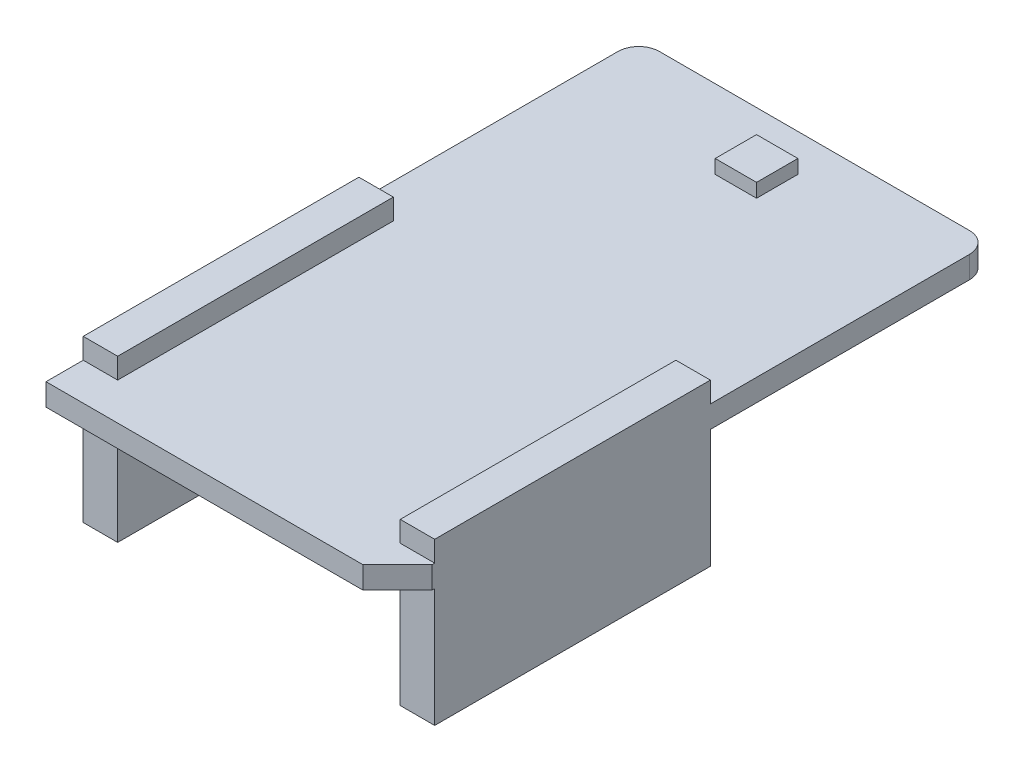
ISO-10303-21;
HEADER;
FILE_DESCRIPTION(('STEP AP214'),'2;1');
FILE_NAME('part.step','',(''),(''),'','','');
FILE_SCHEMA(('AUTOMOTIVE_DESIGN { 1 0 10303 214 1 1 1 1 }'));
ENDSEC;
DATA;
#1=APPLICATION_CONTEXT('core data for automotive mechanical design processes');
#2=APPLICATION_PROTOCOL_DEFINITION('international standard','automotive_design',2000,#1);
#3=PRODUCT_CONTEXT('',#1,'mechanical');
#4=PRODUCT('Part','Part','',(#3));
#5=PRODUCT_RELATED_PRODUCT_CATEGORY('part','',(#4));
#6=PRODUCT_DEFINITION_FORMATION('','',#4);
#7=PRODUCT_DEFINITION_CONTEXT('part definition',#1,'design');
#8=PRODUCT_DEFINITION('design','',#6,#7);
#9=PRODUCT_DEFINITION_SHAPE('','',#8);
#10=(LENGTH_UNIT() NAMED_UNIT(*) SI_UNIT(.MILLI.,.METRE.));
#11=(NAMED_UNIT(*) PLANE_ANGLE_UNIT() SI_UNIT($,.RADIAN.));
#12=(NAMED_UNIT(*) SI_UNIT($,.STERADIAN.) SOLID_ANGLE_UNIT());
#13=UNCERTAINTY_MEASURE_WITH_UNIT(LENGTH_MEASURE(1.E-05),#10,'distance_accuracy_value','');
#14=(GEOMETRIC_REPRESENTATION_CONTEXT(3) GLOBAL_UNCERTAINTY_ASSIGNED_CONTEXT((#13)) GLOBAL_UNIT_ASSIGNED_CONTEXT((#10,
#11,#12)) REPRESENTATION_CONTEXT('',''));
#15=CARTESIAN_POINT('',(0.,0.,0.));
#16=DIRECTION('',(0.,0.,1.));
#17=DIRECTION('',(1.,0.,0.));
#18=AXIS2_PLACEMENT_3D('',#15,#16,#17);
#19=CARTESIAN_POINT('',(0.,1.6,0.));
#20=DIRECTION('',(0.,-1.,0.));
#21=DIRECTION('',(0.,0.,-1.));
#22=AXIS2_PLACEMENT_3D('',#19,#20,#21);
#23=PLANE('',#22);
#24=DIRECTION('',(1.,0.,0.));
#25=VECTOR('',#24,1.);
#26=CARTESIAN_POINT('',(0.,1.6,0.));
#27=LINE('',#26,#25);
#28=CARTESIAN_POINT('',(0.,1.6,0.));
#29=VERTEX_POINT('',#28);
#30=CARTESIAN_POINT('',(23.,1.6,0.));
#31=VERTEX_POINT('',#30);
#32=EDGE_CURVE('E432',#29,#31,#27,.T.);
#33=ORIENTED_EDGE('',*,*,#32,.T.);
#34=DIRECTION('',(-0.70710678118655,0.,0.707106781186546));
#35=VECTOR('',#34,1.);
#36=CARTESIAN_POINT('',(25.5,1.6,-2.5));
#37=LINE('',#36,#35);
#38=CARTESIAN_POINT('',(25.5,1.6,-2.5));
#39=VERTEX_POINT('',#38);
#40=EDGE_CURVE('E12',#31,#39,#37,.F.);
#41=ORIENTED_EDGE('',*,*,#40,.T.);
#42=DIRECTION('',(0.,0.,-1.));
#43=VECTOR('',#42,1.);
#44=CARTESIAN_POINT('',(25.5,1.6,0.));
#45=LINE('',#44,#43);
#46=CARTESIAN_POINT('',(25.5,1.6,-2.7));
#47=VERTEX_POINT('',#46);
#48=EDGE_CURVE('E437',#39,#47,#45,.T.);
#49=ORIENTED_EDGE('',*,*,#48,.T.);
#50=DIRECTION('',(-1.,0.,0.));
#51=VECTOR('',#50,1.);
#52=CARTESIAN_POINT('',(0.,1.6,-2.7));
#53=LINE('',#52,#51);
#54=CARTESIAN_POINT('',(23.,1.6,-2.7));
#55=VERTEX_POINT('',#54);
#56=EDGE_CURVE('E359',#47,#55,#53,.T.);
#57=ORIENTED_EDGE('',*,*,#56,.T.);
#58=DIRECTION('',(0.,0.,-1.));
#59=VECTOR('',#58,1.);
#60=CARTESIAN_POINT('',(23.,1.6,0.));
#61=LINE('',#60,#59);
#62=CARTESIAN_POINT('',(23.,1.6,-22.7));
#63=VERTEX_POINT('',#62);
#64=EDGE_CURVE('E363',#55,#63,#61,.T.);
#65=ORIENTED_EDGE('',*,*,#64,.T.);
#66=DIRECTION('',(1.,0.,0.));
#67=VECTOR('',#66,1.);
#68=CARTESIAN_POINT('',(0.,1.6,-22.7));
#69=LINE('',#68,#67);
#70=CARTESIAN_POINT('',(25.5,1.6,-22.7));
#71=VERTEX_POINT('',#70);
#72=EDGE_CURVE('E367',#63,#71,#69,.T.);
#73=ORIENTED_EDGE('',*,*,#72,.T.);
#74=CARTESIAN_POINT('',(25.5,1.6,-41.5));
#75=VERTEX_POINT('',#74);
#76=EDGE_CURVE('E436',#71,#75,#45,.T.);
#77=ORIENTED_EDGE('',*,*,#76,.T.);
#78=CARTESIAN_POINT('',(24.,1.6,-41.5));
#79=DIRECTION('',(0.,-1.,0.));
#80=DIRECTION('',(0.,0.,-1.));
#81=AXIS2_PLACEMENT_3D('',#78,#79,#80);
#82=CIRCLE('',#81,1.5);
#83=CARTESIAN_POINT('',(24.,1.6,-43.));
#84=VERTEX_POINT('',#83);
#85=EDGE_CURVE('E505',#75,#84,#82,.F.);
#86=ORIENTED_EDGE('',*,*,#85,.T.);
#87=DIRECTION('',(-1.,0.,0.));
#88=VECTOR('',#87,1.);
#89=CARTESIAN_POINT('',(0.,1.6,-43.));
#90=LINE('',#89,#88);
#91=CARTESIAN_POINT('',(1.5,1.6,-43.));
#92=VERTEX_POINT('',#91);
#93=EDGE_CURVE('E440',#84,#92,#90,.T.);
#94=ORIENTED_EDGE('',*,*,#93,.T.);
#95=CARTESIAN_POINT('',(1.5,1.6,-41.5));
#96=DIRECTION('',(0.,-1.,0.));
#97=DIRECTION('',(0.,0.,-1.));
#98=AXIS2_PLACEMENT_3D('',#95,#96,#97);
#99=CIRCLE('',#98,1.5);
#100=CARTESIAN_POINT('',(0.,1.6,-41.5));
#101=VERTEX_POINT('',#100);
#102=EDGE_CURVE('E502',#92,#101,#99,.F.);
#103=ORIENTED_EDGE('',*,*,#102,.T.);
#104=DIRECTION('',(0.,0.,1.));
#105=VECTOR('',#104,1.);
#106=CARTESIAN_POINT('',(0.,1.6,0.));
#107=LINE('',#106,#105);
#108=CARTESIAN_POINT('',(0.,1.6,-22.7));
#109=VERTEX_POINT('',#108);
#110=EDGE_CURVE('E429',#101,#109,#107,.T.);
#111=ORIENTED_EDGE('',*,*,#110,.T.);
#112=DIRECTION('',(1.,0.,0.));
#113=VECTOR('',#112,1.);
#114=CARTESIAN_POINT('',(0.,1.6,-22.7));
#115=LINE('',#114,#113);
#116=CARTESIAN_POINT('',(2.5,1.6,-22.7));
#117=VERTEX_POINT('',#116);
#118=EDGE_CURVE('E416',#109,#117,#115,.T.);
#119=ORIENTED_EDGE('',*,*,#118,.T.);
#120=DIRECTION('',(0.,0.,1.));
#121=VECTOR('',#120,1.);
#122=CARTESIAN_POINT('',(2.49999999999999,1.6,0.));
#123=LINE('',#122,#121);
#124=CARTESIAN_POINT('',(2.5,1.6,-2.7));
#125=VERTEX_POINT('',#124);
#126=EDGE_CURVE('E420',#117,#125,#123,.T.);
#127=ORIENTED_EDGE('',*,*,#126,.T.);
#128=DIRECTION('',(-1.,0.,0.));
#129=VECTOR('',#128,1.);
#130=CARTESIAN_POINT('',(0.,1.6,-2.7));
#131=LINE('',#130,#129);
#132=CARTESIAN_POINT('',(0.,1.6,-2.7));
#133=VERTEX_POINT('',#132);
#134=EDGE_CURVE('E424',#125,#133,#131,.T.);
#135=ORIENTED_EDGE('',*,*,#134,.T.);
#136=EDGE_CURVE('E433',#133,#29,#107,.T.);
#137=ORIENTED_EDGE('',*,*,#136,.T.);
#138=EDGE_LOOP('',(#33,#41,#49,#57,#65,#73,#77,#86,#94,#103,#111,#119,#127,#135,#137));
#139=FACE_BOUND('',#138,.T.);
#140=DIRECTION('',(0.,0.,1.));
#141=VECTOR('',#140,1.);
#142=CARTESIAN_POINT('',(11.25,1.6,-40.3));
#143=LINE('',#142,#141);
#144=CARTESIAN_POINT('',(11.25,1.6,-40.3));
#145=VERTEX_POINT('',#144);
#146=CARTESIAN_POINT('',(11.25,1.6,-37.3));
#147=VERTEX_POINT('',#146);
#148=EDGE_CURVE('E303',#145,#147,#143,.T.);
#149=ORIENTED_EDGE('',*,*,#148,.F.);
#150=DIRECTION('',(-1.,0.,0.));
#151=VECTOR('',#150,1.);
#152=CARTESIAN_POINT('',(11.25,1.6,-40.3));
#153=LINE('',#152,#151);
#154=CARTESIAN_POINT('',(14.25,1.6,-40.3));
#155=VERTEX_POINT('',#154);
#156=EDGE_CURVE('E300',#155,#145,#153,.T.);
#157=ORIENTED_EDGE('',*,*,#156,.F.);
#158=DIRECTION('',(0.,0.,-1.));
#159=VECTOR('',#158,1.);
#160=CARTESIAN_POINT('',(14.25,1.6,-40.3));
#161=LINE('',#160,#159);
#162=CARTESIAN_POINT('',(14.25,1.6,-37.3));
#163=VERTEX_POINT('',#162);
#164=EDGE_CURVE('E525',#163,#155,#161,.T.);
#165=ORIENTED_EDGE('',*,*,#164,.F.);
#166=DIRECTION('',(1.,0.,0.));
#167=VECTOR('',#166,1.);
#168=CARTESIAN_POINT('',(11.25,1.6,-37.3));
#169=LINE('',#168,#167);
#170=EDGE_CURVE('E527',#147,#163,#169,.T.);
#171=ORIENTED_EDGE('',*,*,#170,.F.);
#172=EDGE_LOOP('',(#149,#157,#165,#171));
#173=FACE_BOUND('',#172,.T.);
#174=ADVANCED_FACE('F44',(#139,#173),#23,.F.);
#175=CARTESIAN_POINT('',(0.,1.6,0.));
#176=DIRECTION('',(1.,0.,0.));
#177=DIRECTION('',(0.,0.,-1.));
#178=AXIS2_PLACEMENT_3D('',#175,#176,#177);
#179=PLANE('',#178);
#180=ORIENTED_EDGE('',*,*,#110,.F.);
#181=DIRECTION('',(0.,-1.,0.));
#182=VECTOR('',#181,1.);
#183=CARTESIAN_POINT('',(0.,1.6,-41.5));
#184=LINE('',#183,#182);
#185=CARTESIAN_POINT('',(0.,0.,-41.5));
#186=VERTEX_POINT('',#185);
#187=EDGE_CURVE('E508',#101,#186,#184,.T.);
#188=ORIENTED_EDGE('',*,*,#187,.T.);
#189=DIRECTION('',(0.,0.,1.));
#190=VECTOR('',#189,1.);
#191=CARTESIAN_POINT('',(0.,0.,0.));
#192=LINE('',#191,#190);
#193=CARTESIAN_POINT('',(0.,0.,-22.7));
#194=VERTEX_POINT('',#193);
#195=EDGE_CURVE('E445',#186,#194,#192,.T.);
#196=ORIENTED_EDGE('',*,*,#195,.T.);
#197=DIRECTION('',(0.,-1.,0.));
#198=VECTOR('',#197,1.);
#199=CARTESIAN_POINT('',(0.,24.7556443707464,-22.7));
#200=LINE('',#199,#198);
#201=CARTESIAN_POINT('',(0.,-8.6,-22.7));
#202=VERTEX_POINT('',#201);
#203=EDGE_CURVE('E387',#194,#202,#200,.T.);
#204=ORIENTED_EDGE('',*,*,#203,.T.);
#205=DIRECTION('',(0.,0.,-1.));
#206=VECTOR('',#205,1.);
#207=CARTESIAN_POINT('',(0.,-8.6,-2.7));
#208=LINE('',#207,#206);
#209=CARTESIAN_POINT('',(0.,-8.6,-2.7));
#210=VERTEX_POINT('',#209);
#211=EDGE_CURVE('E371',#210,#202,#208,.T.);
#212=ORIENTED_EDGE('',*,*,#211,.F.);
#213=DIRECTION('',(0.,-1.,0.));
#214=VECTOR('',#213,1.);
#215=CARTESIAN_POINT('',(0.,24.7556443707464,-2.7));
#216=LINE('',#215,#214);
#217=CARTESIAN_POINT('',(0.,0.,-2.7));
#218=VERTEX_POINT('',#217);
#219=EDGE_CURVE('E400',#218,#210,#216,.T.);
#220=ORIENTED_EDGE('',*,*,#219,.F.);
#221=CARTESIAN_POINT('',(0.,0.,0.));
#222=VERTEX_POINT('',#221);
#223=EDGE_CURVE('E428',#218,#222,#192,.T.);
#224=ORIENTED_EDGE('',*,*,#223,.T.);
#225=DIRECTION('',(0.,-1.,0.));
#226=VECTOR('',#225,1.);
#227=CARTESIAN_POINT('',(0.,1.6,0.));
#228=LINE('',#227,#226);
#229=EDGE_CURVE('E444',#29,#222,#228,.T.);
#230=ORIENTED_EDGE('',*,*,#229,.F.);
#231=ORIENTED_EDGE('',*,*,#136,.F.);
#232=CARTESIAN_POINT('',(0.,3.1,-2.7));
#233=VERTEX_POINT('',#232);
#234=EDGE_CURVE('E392',#233,#133,#216,.T.);
#235=ORIENTED_EDGE('',*,*,#234,.F.);
#236=DIRECTION('',(0.,0.,1.));
#237=VECTOR('',#236,1.);
#238=CARTESIAN_POINT('',(0.,3.1,-2.7));
#239=LINE('',#238,#237);
#240=CARTESIAN_POINT('',(0.,3.1,-22.7));
#241=VERTEX_POINT('',#240);
#242=EDGE_CURVE('E394',#241,#233,#239,.T.);
#243=ORIENTED_EDGE('',*,*,#242,.F.);
#244=EDGE_CURVE('E410',#241,#109,#200,.T.);
#245=ORIENTED_EDGE('',*,*,#244,.T.);
#246=EDGE_LOOP('',(#180,#188,#196,#204,#212,#220,#224,#230,#231,#235,#243,#245));
#247=FACE_BOUND('',#246,.T.);
#248=ADVANCED_FACE('F584',(#247),#179,.F.);
#249=CARTESIAN_POINT('',(0.,1.6,0.));
#250=DIRECTION('',(0.,0.,-1.));
#251=DIRECTION('',(-1.,0.,0.));
#252=AXIS2_PLACEMENT_3D('',#249,#250,#251);
#253=PLANE('',#252);
#254=DIRECTION('',(1.,0.,0.));
#255=VECTOR('',#254,1.);
#256=CARTESIAN_POINT('',(0.,0.,0.));
#257=LINE('',#256,#255);
#258=CARTESIAN_POINT('',(23.,0.,0.));
#259=VERTEX_POINT('',#258);
#260=EDGE_CURVE('E448',#222,#259,#257,.T.);
#261=ORIENTED_EDGE('',*,*,#260,.T.);
#262=DIRECTION('',(0.,1.,0.));
#263=VECTOR('',#262,1.);
#264=CARTESIAN_POINT('',(23.,1.6,0.));
#265=LINE('',#264,#263);
#266=EDGE_CURVE('E53',#259,#31,#265,.T.);
#267=ORIENTED_EDGE('',*,*,#266,.T.);
#268=ORIENTED_EDGE('',*,*,#32,.F.);
#269=ORIENTED_EDGE('',*,*,#229,.T.);
#270=EDGE_LOOP('',(#261,#267,#268,#269));
#271=FACE_BOUND('',#270,.T.);
#272=ADVANCED_FACE('F587',(#271),#253,.F.);
#273=CARTESIAN_POINT('',(25.5,1.6,0.));
#274=DIRECTION('',(-1.,0.,0.));
#275=DIRECTION('',(0.,0.,1.));
#276=AXIS2_PLACEMENT_3D('',#273,#274,#275);
#277=PLANE('',#276);
#278=ORIENTED_EDGE('',*,*,#48,.F.);
#279=DIRECTION('',(0.,-1.,0.));
#280=VECTOR('',#279,1.);
#281=CARTESIAN_POINT('',(25.5,1.6,-2.5));
#282=LINE('',#281,#280);
#283=CARTESIAN_POINT('',(25.5,0.,-2.5));
#284=VERTEX_POINT('',#283);
#285=EDGE_CURVE('E512',#39,#284,#282,.T.);
#286=ORIENTED_EDGE('',*,*,#285,.T.);
#287=DIRECTION('',(0.,0.,-1.));
#288=VECTOR('',#287,1.);
#289=CARTESIAN_POINT('',(25.5,0.,0.));
#290=LINE('',#289,#288);
#291=CARTESIAN_POINT('',(25.5,0.,-2.7));
#292=VERTEX_POINT('',#291);
#293=EDGE_CURVE('E452',#284,#292,#290,.T.);
#294=ORIENTED_EDGE('',*,*,#293,.T.);
#295=DIRECTION('',(0.,-1.,0.));
#296=VECTOR('',#295,1.);
#297=CARTESIAN_POINT('',(25.5,24.7556443707464,-2.7));
#298=LINE('',#297,#296);
#299=CARTESIAN_POINT('',(25.5,-8.6,-2.7));
#300=VERTEX_POINT('',#299);
#301=EDGE_CURVE('E329',#292,#300,#298,.T.);
#302=ORIENTED_EDGE('',*,*,#301,.T.);
#303=DIRECTION('',(0.,0.,1.));
#304=VECTOR('',#303,1.);
#305=CARTESIAN_POINT('',(25.5,-8.6,-2.7));
#306=LINE('',#305,#304);
#307=CARTESIAN_POINT('',(25.5,-8.6,-22.7));
#308=VERTEX_POINT('',#307);
#309=EDGE_CURVE('E305',#308,#300,#306,.T.);
#310=ORIENTED_EDGE('',*,*,#309,.F.);
#311=DIRECTION('',(0.,-1.,0.));
#312=VECTOR('',#311,1.);
#313=CARTESIAN_POINT('',(25.5,24.7556443707464,-22.7));
#314=LINE('',#313,#312);
#315=CARTESIAN_POINT('',(25.5,0.,-22.7));
#316=VERTEX_POINT('',#315);
#317=EDGE_CURVE('E343',#316,#308,#314,.T.);
#318=ORIENTED_EDGE('',*,*,#317,.F.);
#319=CARTESIAN_POINT('',(25.5,0.,-41.5));
#320=VERTEX_POINT('',#319);
#321=EDGE_CURVE('E451',#316,#320,#290,.T.);
#322=ORIENTED_EDGE('',*,*,#321,.T.);
#323=DIRECTION('',(0.,-1.,0.));
#324=VECTOR('',#323,1.);
#325=CARTESIAN_POINT('',(25.5,1.6,-41.5));
#326=LINE('',#325,#324);
#327=EDGE_CURVE('E499',#320,#75,#326,.F.);
#328=ORIENTED_EDGE('',*,*,#327,.T.);
#329=ORIENTED_EDGE('',*,*,#76,.F.);
#330=CARTESIAN_POINT('',(25.5,3.1,-22.7));
#331=VERTEX_POINT('',#330);
#332=EDGE_CURVE('E334',#331,#71,#314,.T.);
#333=ORIENTED_EDGE('',*,*,#332,.F.);
#334=DIRECTION('',(0.,0.,-1.));
#335=VECTOR('',#334,1.);
#336=CARTESIAN_POINT('',(25.5,3.1,-2.7));
#337=LINE('',#336,#335);
#338=CARTESIAN_POINT('',(25.5,3.1,-2.7));
#339=VERTEX_POINT('',#338);
#340=EDGE_CURVE('E337',#339,#331,#337,.T.);
#341=ORIENTED_EDGE('',*,*,#340,.F.);
#342=EDGE_CURVE('E353',#339,#47,#298,.T.);
#343=ORIENTED_EDGE('',*,*,#342,.T.);
#344=EDGE_LOOP('',(#278,#286,#294,#302,#310,#318,#322,#328,#329,#333,#341,#343));
#345=FACE_BOUND('',#344,.T.);
#346=ADVANCED_FACE('F560',(#345),#277,.F.);
#347=CARTESIAN_POINT('',(0.,1.6,-43.));
#348=DIRECTION('',(0.,0.,1.));
#349=DIRECTION('',(1.,0.,0.));
#350=AXIS2_PLACEMENT_3D('',#347,#348,#349);
#351=PLANE('',#350);
#352=ORIENTED_EDGE('',*,*,#93,.F.);
#353=DIRECTION('',(0.,-1.,0.));
#354=VECTOR('',#353,1.);
#355=CARTESIAN_POINT('',(24.,1.6,-43.));
#356=LINE('',#355,#354);
#357=CARTESIAN_POINT('',(24.,0.,-43.));
#358=VERTEX_POINT('',#357);
#359=EDGE_CURVE('E489',#84,#358,#356,.T.);
#360=ORIENTED_EDGE('',*,*,#359,.T.);
#361=DIRECTION('',(-1.,0.,0.));
#362=VECTOR('',#361,1.);
#363=CARTESIAN_POINT('',(0.,0.,-43.));
#364=LINE('',#363,#362);
#365=CARTESIAN_POINT('',(1.5,0.,-43.));
#366=VERTEX_POINT('',#365);
#367=EDGE_CURVE('E455',#358,#366,#364,.T.);
#368=ORIENTED_EDGE('',*,*,#367,.T.);
#369=DIRECTION('',(0.,-1.,0.));
#370=VECTOR('',#369,1.);
#371=CARTESIAN_POINT('',(1.5,1.6,-43.));
#372=LINE('',#371,#370);
#373=EDGE_CURVE('E486',#366,#92,#372,.F.);
#374=ORIENTED_EDGE('',*,*,#373,.T.);
#375=EDGE_LOOP('',(#352,#360,#368,#374));
#376=FACE_BOUND('',#375,.T.);
#377=ADVANCED_FACE('F619',(#376),#351,.F.);
#378=CARTESIAN_POINT('',(0.,0.,0.));
#379=DIRECTION('',(0.,-1.,0.));
#380=DIRECTION('',(0.,0.,-1.));
#381=AXIS2_PLACEMENT_3D('',#378,#379,#380);
#382=PLANE('',#381);
#383=ORIENTED_EDGE('',*,*,#293,.F.);
#384=DIRECTION('',(0.70710678118655,0.,-0.707106781186546));
#385=VECTOR('',#384,1.);
#386=CARTESIAN_POINT('',(11.4999999999999,0.,11.5));
#387=LINE('',#386,#385);
#388=EDGE_CURVE('E71',#284,#259,#387,.F.);
#389=ORIENTED_EDGE('',*,*,#388,.T.);
#390=ORIENTED_EDGE('',*,*,#260,.F.);
#391=ORIENTED_EDGE('',*,*,#223,.F.);
#392=DIRECTION('',(-1.,0.,0.));
#393=VECTOR('',#392,1.);
#394=CARTESIAN_POINT('',(0.,0.,-2.7));
#395=LINE('',#394,#393);
#396=CARTESIAN_POINT('',(2.5,0.,-2.7));
#397=VERTEX_POINT('',#396);
#398=EDGE_CURVE('E470',#397,#218,#395,.T.);
#399=ORIENTED_EDGE('',*,*,#398,.F.);
#400=DIRECTION('',(0.,0.,1.));
#401=VECTOR('',#400,1.);
#402=CARTESIAN_POINT('',(2.49999999999999,0.,0.));
#403=LINE('',#402,#401);
#404=CARTESIAN_POINT('',(2.5,0.,-22.7));
#405=VERTEX_POINT('',#404);
#406=EDGE_CURVE('E466',#405,#397,#403,.T.);
#407=ORIENTED_EDGE('',*,*,#406,.F.);
#408=DIRECTION('',(1.,0.,0.));
#409=VECTOR('',#408,1.);
#410=CARTESIAN_POINT('',(0.,0.,-22.7));
#411=LINE('',#410,#409);
#412=EDGE_CURVE('E462',#194,#405,#411,.T.);
#413=ORIENTED_EDGE('',*,*,#412,.F.);
#414=ORIENTED_EDGE('',*,*,#195,.F.);
#415=CARTESIAN_POINT('',(1.5,0.,-41.5));
#416=DIRECTION('',(0.,-1.,0.));
#417=DIRECTION('',(0.,0.,-1.));
#418=AXIS2_PLACEMENT_3D('',#415,#416,#417);
#419=CIRCLE('',#418,1.5);
#420=EDGE_CURVE('E493',#186,#366,#419,.T.);
#421=ORIENTED_EDGE('',*,*,#420,.T.);
#422=ORIENTED_EDGE('',*,*,#367,.F.);
#423=CARTESIAN_POINT('',(24.,0.,-41.5));
#424=DIRECTION('',(0.,-1.,0.));
#425=DIRECTION('',(0.,0.,-1.));
#426=AXIS2_PLACEMENT_3D('',#423,#424,#425);
#427=CIRCLE('',#426,1.5);
#428=EDGE_CURVE('E496',#358,#320,#427,.T.);
#429=ORIENTED_EDGE('',*,*,#428,.T.);
#430=ORIENTED_EDGE('',*,*,#321,.F.);
#431=DIRECTION('',(1.,0.,0.));
#432=VECTOR('',#431,1.);
#433=CARTESIAN_POINT('',(0.,0.,-22.7));
#434=LINE('',#433,#432);
#435=CARTESIAN_POINT('',(23.,0.,-22.7));
#436=VERTEX_POINT('',#435);
#437=EDGE_CURVE('E482',#436,#316,#434,.T.);
#438=ORIENTED_EDGE('',*,*,#437,.F.);
#439=DIRECTION('',(0.,0.,-1.));
#440=VECTOR('',#439,1.);
#441=CARTESIAN_POINT('',(23.,0.,0.));
#442=LINE('',#441,#440);
#443=CARTESIAN_POINT('',(23.,0.,-2.7));
#444=VERTEX_POINT('',#443);
#445=EDGE_CURVE('E478',#444,#436,#442,.T.);
#446=ORIENTED_EDGE('',*,*,#445,.F.);
#447=DIRECTION('',(-1.,0.,0.));
#448=VECTOR('',#447,1.);
#449=CARTESIAN_POINT('',(0.,0.,-2.7));
#450=LINE('',#449,#448);
#451=EDGE_CURVE('E474',#292,#444,#450,.T.);
#452=ORIENTED_EDGE('',*,*,#451,.F.);
#453=EDGE_LOOP('',(#383,#389,#390,#391,#399,#407,#413,#414,#421,#422,#429,#430,#438,#446,#452));
#454=FACE_BOUND('',#453,.T.);
#455=ADVANCED_FACE('F581',(#454),#382,.T.);
#456=CARTESIAN_POINT('',(0.,-8.6,0.));
#457=DIRECTION('',(0.,-1.,0.));
#458=DIRECTION('',(0.,0.,-1.));
#459=AXIS2_PLACEMENT_3D('',#456,#457,#458);
#460=PLANE('',#459);
#461=ORIENTED_EDGE('',*,*,#211,.T.);
#462=DIRECTION('',(1.,0.,0.));
#463=VECTOR('',#462,1.);
#464=CARTESIAN_POINT('',(0.,-8.6,-22.7));
#465=LINE('',#464,#463);
#466=CARTESIAN_POINT('',(2.5,-8.6,-22.7));
#467=VERTEX_POINT('',#466);
#468=EDGE_CURVE('E375',#202,#467,#465,.T.);
#469=ORIENTED_EDGE('',*,*,#468,.T.);
#470=DIRECTION('',(0.,0.,1.));
#471=VECTOR('',#470,1.);
#472=CARTESIAN_POINT('',(2.5,-8.6,-2.7));
#473=LINE('',#472,#471);
#474=CARTESIAN_POINT('',(2.5,-8.6,-2.7));
#475=VERTEX_POINT('',#474);
#476=EDGE_CURVE('E379',#467,#475,#473,.T.);
#477=ORIENTED_EDGE('',*,*,#476,.T.);
#478=DIRECTION('',(-1.,0.,0.));
#479=VECTOR('',#478,1.);
#480=CARTESIAN_POINT('',(0.,-8.6,-2.7));
#481=LINE('',#480,#479);
#482=EDGE_CURVE('E383',#475,#210,#481,.T.);
#483=ORIENTED_EDGE('',*,*,#482,.T.);
#484=EDGE_LOOP('',(#461,#469,#477,#483));
#485=FACE_BOUND('',#484,.T.);
#486=ADVANCED_FACE('F543',(#485),#460,.T.);
#487=CARTESIAN_POINT('',(0.,24.7556443707464,-22.7));
#488=DIRECTION('',(0.,0.,-1.));
#489=DIRECTION('',(-1.,0.,0.));
#490=AXIS2_PLACEMENT_3D('',#487,#488,#489);
#491=PLANE('',#490);
#492=ORIENTED_EDGE('',*,*,#203,.F.);
#493=ORIENTED_EDGE('',*,*,#412,.T.);
#494=DIRECTION('',(0.,-1.,0.));
#495=VECTOR('',#494,1.);
#496=CARTESIAN_POINT('',(2.5,24.7556443707464,-22.7));
#497=LINE('',#496,#495);
#498=EDGE_CURVE('E409',#405,#467,#497,.T.);
#499=ORIENTED_EDGE('',*,*,#498,.T.);
#500=ORIENTED_EDGE('',*,*,#468,.F.);
#501=EDGE_LOOP('',(#492,#493,#499,#500));
#502=FACE_BOUND('',#501,.T.);
#503=ADVANCED_FACE('F578',(#502),#491,.T.);
#504=CARTESIAN_POINT('',(2.5,24.7556443707464,-2.7));
#505=DIRECTION('',(1.,0.,0.));
#506=DIRECTION('',(0.,0.,-1.));
#507=AXIS2_PLACEMENT_3D('',#504,#505,#506);
#508=PLANE('',#507);
#509=ORIENTED_EDGE('',*,*,#498,.F.);
#510=ORIENTED_EDGE('',*,*,#406,.T.);
#511=DIRECTION('',(0.,-1.,0.));
#512=VECTOR('',#511,1.);
#513=CARTESIAN_POINT('',(2.5,24.7556443707464,-2.7));
#514=LINE('',#513,#512);
#515=EDGE_CURVE('E405',#397,#475,#514,.T.);
#516=ORIENTED_EDGE('',*,*,#515,.T.);
#517=ORIENTED_EDGE('',*,*,#476,.F.);
#518=EDGE_LOOP('',(#509,#510,#516,#517));
#519=FACE_BOUND('',#518,.T.);
#520=ADVANCED_FACE('F539',(#519),#508,.T.);
#521=CARTESIAN_POINT('',(0.,24.7556443707464,-2.7));
#522=DIRECTION('',(0.,0.,1.));
#523=DIRECTION('',(1.,0.,0.));
#524=AXIS2_PLACEMENT_3D('',#521,#522,#523);
#525=PLANE('',#524);
#526=ORIENTED_EDGE('',*,*,#515,.F.);
#527=ORIENTED_EDGE('',*,*,#398,.T.);
#528=ORIENTED_EDGE('',*,*,#219,.T.);
#529=ORIENTED_EDGE('',*,*,#482,.F.);
#530=EDGE_LOOP('',(#526,#527,#528,#529));
#531=FACE_BOUND('',#530,.T.);
#532=ADVANCED_FACE('F546',(#531),#525,.T.);
#533=ORIENTED_EDGE('',*,*,#134,.F.);
#534=CARTESIAN_POINT('',(2.5,3.1,-2.7));
#535=VERTEX_POINT('',#534);
#536=EDGE_CURVE('E401',#535,#125,#514,.T.);
#537=ORIENTED_EDGE('',*,*,#536,.F.);
#538=DIRECTION('',(1.,0.,0.));
#539=VECTOR('',#538,1.);
#540=CARTESIAN_POINT('',(0.,3.1,-2.7));
#541=LINE('',#540,#539);
#542=EDGE_CURVE('E391',#233,#535,#541,.T.);
#543=ORIENTED_EDGE('',*,*,#542,.F.);
#544=ORIENTED_EDGE('',*,*,#234,.T.);
#545=EDGE_LOOP('',(#533,#537,#543,#544));
#546=FACE_BOUND('',#545,.T.);
#547=ADVANCED_FACE('F654',(#546),#525,.T.);
#548=ORIENTED_EDGE('',*,*,#126,.F.);
#549=CARTESIAN_POINT('',(2.5,3.1,-22.7));
#550=VERTEX_POINT('',#549);
#551=EDGE_CURVE('E406',#550,#117,#497,.T.);
#552=ORIENTED_EDGE('',*,*,#551,.F.);
#553=DIRECTION('',(0.,0.,-1.));
#554=VECTOR('',#553,1.);
#555=CARTESIAN_POINT('',(2.5,3.1,-2.7));
#556=LINE('',#555,#554);
#557=EDGE_CURVE('E388',#535,#550,#556,.T.);
#558=ORIENTED_EDGE('',*,*,#557,.F.);
#559=ORIENTED_EDGE('',*,*,#536,.T.);
#560=EDGE_LOOP('',(#548,#552,#558,#559));
#561=FACE_BOUND('',#560,.T.);
#562=ADVANCED_FACE('F649',(#561),#508,.T.);
#563=ORIENTED_EDGE('',*,*,#118,.F.);
#564=ORIENTED_EDGE('',*,*,#244,.F.);
#565=DIRECTION('',(-1.,0.,0.));
#566=VECTOR('',#565,1.);
#567=CARTESIAN_POINT('',(0.,3.1,-22.7));
#568=LINE('',#567,#566);
#569=EDGE_CURVE('E397',#550,#241,#568,.T.);
#570=ORIENTED_EDGE('',*,*,#569,.F.);
#571=ORIENTED_EDGE('',*,*,#551,.T.);
#572=EDGE_LOOP('',(#563,#564,#570,#571));
#573=FACE_BOUND('',#572,.T.);
#574=ADVANCED_FACE('F645',(#573),#491,.T.);
#575=CARTESIAN_POINT('',(0.,3.1,0.));
#576=DIRECTION('',(0.,-1.,0.));
#577=DIRECTION('',(0.,0.,-1.));
#578=AXIS2_PLACEMENT_3D('',#575,#576,#577);
#579=PLANE('',#578);
#580=ORIENTED_EDGE('',*,*,#242,.T.);
#581=ORIENTED_EDGE('',*,*,#542,.T.);
#582=ORIENTED_EDGE('',*,*,#557,.T.);
#583=ORIENTED_EDGE('',*,*,#569,.T.);
#584=EDGE_LOOP('',(#580,#581,#582,#583));
#585=FACE_BOUND('',#584,.T.);
#586=ADVANCED_FACE('F656',(#585),#579,.F.);
#587=CARTESIAN_POINT('',(0.,-8.6,0.));
#588=DIRECTION('',(0.,1.,0.));
#589=DIRECTION('',(0.,0.,1.));
#590=AXIS2_PLACEMENT_3D('',#587,#588,#589);
#591=PLANE('',#590);
#592=ORIENTED_EDGE('',*,*,#309,.T.);
#593=DIRECTION('',(-1.,0.,0.));
#594=VECTOR('',#593,1.);
#595=CARTESIAN_POINT('',(25.5,-8.6,-2.7));
#596=LINE('',#595,#594);
#597=CARTESIAN_POINT('',(23.,-8.6,-2.7));
#598=VERTEX_POINT('',#597);
#599=EDGE_CURVE('E311',#300,#598,#596,.T.);
#600=ORIENTED_EDGE('',*,*,#599,.T.);
#601=DIRECTION('',(0.,0.,-1.));
#602=VECTOR('',#601,1.);
#603=CARTESIAN_POINT('',(23.,-8.6,-2.7));
#604=LINE('',#603,#602);
#605=CARTESIAN_POINT('',(23.,-8.6,-22.7));
#606=VERTEX_POINT('',#605);
#607=EDGE_CURVE('E321',#598,#606,#604,.T.);
#608=ORIENTED_EDGE('',*,*,#607,.T.);
#609=DIRECTION('',(1.,0.,0.));
#610=VECTOR('',#609,1.);
#611=CARTESIAN_POINT('',(25.5,-8.6,-22.7));
#612=LINE('',#611,#610);
#613=EDGE_CURVE('E325',#606,#308,#612,.T.);
#614=ORIENTED_EDGE('',*,*,#613,.T.);
#615=EDGE_LOOP('',(#592,#600,#608,#614));
#616=FACE_BOUND('',#615,.T.);
#617=ADVANCED_FACE('F568',(#616),#591,.F.);
#618=CARTESIAN_POINT('',(25.5,24.7556443707464,-2.7));
#619=DIRECTION('',(0.,0.,1.));
#620=DIRECTION('',(1.,0.,0.));
#621=AXIS2_PLACEMENT_3D('',#618,#619,#620);
#622=PLANE('',#621);
#623=ORIENTED_EDGE('',*,*,#301,.F.);
#624=ORIENTED_EDGE('',*,*,#451,.T.);
#625=DIRECTION('',(0.,-1.,0.));
#626=VECTOR('',#625,1.);
#627=CARTESIAN_POINT('',(23.,24.7556443707464,-2.7));
#628=LINE('',#627,#626);
#629=EDGE_CURVE('E352',#444,#598,#628,.T.);
#630=ORIENTED_EDGE('',*,*,#629,.T.);
#631=ORIENTED_EDGE('',*,*,#599,.F.);
#632=EDGE_LOOP('',(#623,#624,#630,#631));
#633=FACE_BOUND('',#632,.T.);
#634=ADVANCED_FACE('F564',(#633),#622,.T.);
#635=CARTESIAN_POINT('',(23.,24.7556443707464,-2.7));
#636=DIRECTION('',(-1.,0.,0.));
#637=DIRECTION('',(0.,0.,1.));
#638=AXIS2_PLACEMENT_3D('',#635,#636,#637);
#639=PLANE('',#638);
#640=ORIENTED_EDGE('',*,*,#629,.F.);
#641=ORIENTED_EDGE('',*,*,#445,.T.);
#642=DIRECTION('',(0.,-1.,0.));
#643=VECTOR('',#642,1.);
#644=CARTESIAN_POINT('',(23.,24.7556443707464,-22.7));
#645=LINE('',#644,#643);
#646=EDGE_CURVE('E348',#436,#606,#645,.T.);
#647=ORIENTED_EDGE('',*,*,#646,.T.);
#648=ORIENTED_EDGE('',*,*,#607,.F.);
#649=EDGE_LOOP('',(#640,#641,#647,#648));
#650=FACE_BOUND('',#649,.T.);
#651=ADVANCED_FACE('F594',(#650),#639,.T.);
#652=CARTESIAN_POINT('',(25.5,24.7556443707464,-22.7));
#653=DIRECTION('',(0.,0.,-1.));
#654=DIRECTION('',(-1.,0.,0.));
#655=AXIS2_PLACEMENT_3D('',#652,#653,#654);
#656=PLANE('',#655);
#657=ORIENTED_EDGE('',*,*,#646,.F.);
#658=ORIENTED_EDGE('',*,*,#437,.T.);
#659=ORIENTED_EDGE('',*,*,#317,.T.);
#660=ORIENTED_EDGE('',*,*,#613,.F.);
#661=EDGE_LOOP('',(#657,#658,#659,#660));
#662=FACE_BOUND('',#661,.T.);
#663=ADVANCED_FACE('F572',(#662),#656,.T.);
#664=ORIENTED_EDGE('',*,*,#72,.F.);
#665=CARTESIAN_POINT('',(23.,3.1,-22.7));
#666=VERTEX_POINT('',#665);
#667=EDGE_CURVE('E344',#666,#63,#645,.T.);
#668=ORIENTED_EDGE('',*,*,#667,.F.);
#669=DIRECTION('',(-1.,0.,0.));
#670=VECTOR('',#669,1.);
#671=CARTESIAN_POINT('',(25.5,3.1,-22.7));
#672=LINE('',#671,#670);
#673=EDGE_CURVE('E333',#331,#666,#672,.T.);
#674=ORIENTED_EDGE('',*,*,#673,.F.);
#675=ORIENTED_EDGE('',*,*,#332,.T.);
#676=EDGE_LOOP('',(#664,#668,#674,#675));
#677=FACE_BOUND('',#676,.T.);
#678=ADVANCED_FACE('F602',(#677),#656,.T.);
#679=ORIENTED_EDGE('',*,*,#64,.F.);
#680=CARTESIAN_POINT('',(23.,3.1,-2.7));
#681=VERTEX_POINT('',#680);
#682=EDGE_CURVE('E349',#681,#55,#628,.T.);
#683=ORIENTED_EDGE('',*,*,#682,.F.);
#684=DIRECTION('',(0.,0.,1.));
#685=VECTOR('',#684,1.);
#686=CARTESIAN_POINT('',(23.,3.1,-2.7));
#687=LINE('',#686,#685);
#688=EDGE_CURVE('E330',#666,#681,#687,.T.);
#689=ORIENTED_EDGE('',*,*,#688,.F.);
#690=ORIENTED_EDGE('',*,*,#667,.T.);
#691=EDGE_LOOP('',(#679,#683,#689,#690));
#692=FACE_BOUND('',#691,.T.);
#693=ADVANCED_FACE('F597',(#692),#639,.T.);
#694=ORIENTED_EDGE('',*,*,#56,.F.);
#695=ORIENTED_EDGE('',*,*,#342,.F.);
#696=DIRECTION('',(1.,0.,0.));
#697=VECTOR('',#696,1.);
#698=CARTESIAN_POINT('',(25.5,3.1,-2.7));
#699=LINE('',#698,#697);
#700=EDGE_CURVE('E340',#681,#339,#699,.T.);
#701=ORIENTED_EDGE('',*,*,#700,.F.);
#702=ORIENTED_EDGE('',*,*,#682,.T.);
#703=EDGE_LOOP('',(#694,#695,#701,#702));
#704=FACE_BOUND('',#703,.T.);
#705=ADVANCED_FACE('F605',(#704),#622,.T.);
#706=CARTESIAN_POINT('',(0.,3.1,0.));
#707=DIRECTION('',(0.,-1.,0.));
#708=DIRECTION('',(0.,0.,-1.));
#709=AXIS2_PLACEMENT_3D('',#706,#707,#708);
#710=PLANE('',#709);
#711=ORIENTED_EDGE('',*,*,#340,.T.);
#712=ORIENTED_EDGE('',*,*,#673,.T.);
#713=ORIENTED_EDGE('',*,*,#688,.T.);
#714=ORIENTED_EDGE('',*,*,#700,.T.);
#715=EDGE_LOOP('',(#711,#712,#713,#714));
#716=FACE_BOUND('',#715,.T.);
#717=ADVANCED_FACE('F817',(#716),#710,.F.);
#718=CARTESIAN_POINT('',(11.25,2.6,-40.3));
#719=DIRECTION('',(1.,0.,0.));
#720=DIRECTION('',(0.,0.,-1.));
#721=AXIS2_PLACEMENT_3D('',#718,#719,#720);
#722=PLANE('',#721);
#723=ORIENTED_EDGE('',*,*,#148,.T.);
#724=DIRECTION('',(0.,-1.,0.));
#725=VECTOR('',#724,1.);
#726=CARTESIAN_POINT('',(11.25,2.6,-37.3));
#727=LINE('',#726,#725);
#728=CARTESIAN_POINT('',(11.25,2.6,-37.3));
#729=VERTEX_POINT('',#728);
#730=EDGE_CURVE('E282',#729,#147,#727,.T.);
#731=ORIENTED_EDGE('',*,*,#730,.F.);
#732=DIRECTION('',(0.,0.,1.));
#733=VECTOR('',#732,1.);
#734=CARTESIAN_POINT('',(11.25,2.6,-40.3));
#735=LINE('',#734,#733);
#736=CARTESIAN_POINT('',(11.25,2.6,-40.3));
#737=VERTEX_POINT('',#736);
#738=EDGE_CURVE('E290',#737,#729,#735,.T.);
#739=ORIENTED_EDGE('',*,*,#738,.F.);
#740=DIRECTION('',(0.,-1.,0.));
#741=VECTOR('',#740,1.);
#742=CARTESIAN_POINT('',(11.25,2.6,-40.3));
#743=LINE('',#742,#741);
#744=EDGE_CURVE('E533',#737,#145,#743,.T.);
#745=ORIENTED_EDGE('',*,*,#744,.T.);
#746=EDGE_LOOP('',(#723,#731,#739,#745));
#747=FACE_BOUND('',#746,.T.);
#748=ADVANCED_FACE('F302',(#747),#722,.F.);
#749=CARTESIAN_POINT('',(11.25,2.6,-37.3));
#750=DIRECTION('',(0.,0.,-1.));
#751=DIRECTION('',(-1.,0.,0.));
#752=AXIS2_PLACEMENT_3D('',#749,#750,#751);
#753=PLANE('',#752);
#754=ORIENTED_EDGE('',*,*,#170,.T.);
#755=DIRECTION('',(0.,-1.,0.));
#756=VECTOR('',#755,1.);
#757=CARTESIAN_POINT('',(14.25,2.6,-37.3));
#758=LINE('',#757,#756);
#759=CARTESIAN_POINT('',(14.25,2.6,-37.3));
#760=VERTEX_POINT('',#759);
#761=EDGE_CURVE('E285',#760,#163,#758,.T.);
#762=ORIENTED_EDGE('',*,*,#761,.F.);
#763=DIRECTION('',(1.,0.,0.));
#764=VECTOR('',#763,1.);
#765=CARTESIAN_POINT('',(11.25,2.6,-37.3));
#766=LINE('',#765,#764);
#767=EDGE_CURVE('E277',#729,#760,#766,.T.);
#768=ORIENTED_EDGE('',*,*,#767,.F.);
#769=ORIENTED_EDGE('',*,*,#730,.T.);
#770=EDGE_LOOP('',(#754,#762,#768,#769));
#771=FACE_BOUND('',#770,.T.);
#772=ADVANCED_FACE('F280',(#771),#753,.F.);
#773=CARTESIAN_POINT('',(14.25,2.6,-40.3));
#774=DIRECTION('',(-1.,0.,0.));
#775=DIRECTION('',(0.,0.,1.));
#776=AXIS2_PLACEMENT_3D('',#773,#774,#775);
#777=PLANE('',#776);
#778=ORIENTED_EDGE('',*,*,#164,.T.);
#779=DIRECTION('',(0.,-1.,0.));
#780=VECTOR('',#779,1.);
#781=CARTESIAN_POINT('',(14.25,2.6,-40.3));
#782=LINE('',#781,#780);
#783=CARTESIAN_POINT('',(14.25,2.6,-40.3));
#784=VERTEX_POINT('',#783);
#785=EDGE_CURVE('E314',#784,#155,#782,.T.);
#786=ORIENTED_EDGE('',*,*,#785,.F.);
#787=DIRECTION('',(0.,0.,-1.));
#788=VECTOR('',#787,1.);
#789=CARTESIAN_POINT('',(14.25,2.6,-40.3));
#790=LINE('',#789,#788);
#791=EDGE_CURVE('E289',#760,#784,#790,.T.);
#792=ORIENTED_EDGE('',*,*,#791,.F.);
#793=ORIENTED_EDGE('',*,*,#761,.T.);
#794=EDGE_LOOP('',(#778,#786,#792,#793));
#795=FACE_BOUND('',#794,.T.);
#796=ADVANCED_FACE('F711',(#795),#777,.F.);
#797=CARTESIAN_POINT('',(11.25,2.6,-40.3));
#798=DIRECTION('',(0.,0.,1.));
#799=DIRECTION('',(1.,0.,0.));
#800=AXIS2_PLACEMENT_3D('',#797,#798,#799);
#801=PLANE('',#800);
#802=ORIENTED_EDGE('',*,*,#156,.T.);
#803=ORIENTED_EDGE('',*,*,#744,.F.);
#804=DIRECTION('',(-1.,0.,0.));
#805=VECTOR('',#804,1.);
#806=CARTESIAN_POINT('',(11.25,2.6,-40.3));
#807=LINE('',#806,#805);
#808=EDGE_CURVE('E295',#784,#737,#807,.T.);
#809=ORIENTED_EDGE('',*,*,#808,.F.);
#810=ORIENTED_EDGE('',*,*,#785,.T.);
#811=EDGE_LOOP('',(#802,#803,#809,#810));
#812=FACE_BOUND('',#811,.T.);
#813=ADVANCED_FACE('F715',(#812),#801,.F.);
#814=CARTESIAN_POINT('',(0.,2.6,0.));
#815=DIRECTION('',(0.,1.,0.));
#816=DIRECTION('',(0.,0.,1.));
#817=AXIS2_PLACEMENT_3D('',#814,#815,#816);
#818=PLANE('',#817);
#819=ORIENTED_EDGE('',*,*,#738,.T.);
#820=ORIENTED_EDGE('',*,*,#767,.T.);
#821=ORIENTED_EDGE('',*,*,#791,.T.);
#822=ORIENTED_EDGE('',*,*,#808,.T.);
#823=EDGE_LOOP('',(#819,#820,#821,#822));
#824=FACE_BOUND('',#823,.T.);
#825=ADVANCED_FACE('F293',(#824),#818,.T.);
#826=CARTESIAN_POINT('',(24.,1.6,-41.5));
#827=DIRECTION('',(0.,-1.,0.));
#828=DIRECTION('',(0.,0.,-1.));
#829=AXIS2_PLACEMENT_3D('',#826,#827,#828);
#830=CYLINDRICAL_SURFACE('',#829,1.5);
#831=ORIENTED_EDGE('',*,*,#85,.F.);
#832=ORIENTED_EDGE('',*,*,#327,.F.);
#833=ORIENTED_EDGE('',*,*,#428,.F.);
#834=ORIENTED_EDGE('',*,*,#359,.F.);
#835=EDGE_LOOP('',(#831,#832,#833,#834));
#836=FACE_BOUND('',#835,.T.);
#837=ADVANCED_FACE('F627',(#836),#830,.T.);
#838=CARTESIAN_POINT('',(1.5,1.6,-41.5));
#839=DIRECTION('',(0.,-1.,0.));
#840=DIRECTION('',(0.,0.,-1.));
#841=AXIS2_PLACEMENT_3D('',#838,#839,#840);
#842=CYLINDRICAL_SURFACE('',#841,1.5);
#843=ORIENTED_EDGE('',*,*,#102,.F.);
#844=ORIENTED_EDGE('',*,*,#373,.F.);
#845=ORIENTED_EDGE('',*,*,#420,.F.);
#846=ORIENTED_EDGE('',*,*,#187,.F.);
#847=EDGE_LOOP('',(#843,#844,#845,#846));
#848=FACE_BOUND('',#847,.T.);
#849=ADVANCED_FACE('F629',(#848),#842,.T.);
#850=CARTESIAN_POINT('',(25.5,1.6,-2.5));
#851=DIRECTION('',(-0.707106781186545,0.,-0.707106781186549));
#852=DIRECTION('',(0.,-1.,0.));
#853=AXIS2_PLACEMENT_3D('',#850,#851,#852);
#854=PLANE('',#853);
#855=ORIENTED_EDGE('',*,*,#40,.F.);
#856=ORIENTED_EDGE('',*,*,#266,.F.);
#857=ORIENTED_EDGE('',*,*,#388,.F.);
#858=ORIENTED_EDGE('',*,*,#285,.F.);
#859=EDGE_LOOP('',(#855,#856,#857,#858));
#860=FACE_BOUND('',#859,.T.);
#861=ADVANCED_FACE('F46',(#860),#854,.F.);
#862=CLOSED_SHELL('',(#174,#248,#272,#346,#377,#455,#486,#503,#520,#532,#547,#562,#574,#586,
#617,#634,#651,#663,#678,#693,#705,#717,#748,#772,#796,#813,#825,#837,#849,#861));
#863=MANIFOLD_SOLID_BREP('B2',#862);
#864=ADVANCED_BREP_SHAPE_REPRESENTATION('',(#18,#863),#14);
#865=SHAPE_DEFINITION_REPRESENTATION(#9,#864);
ENDSEC;
END-ISO-10303-21;
